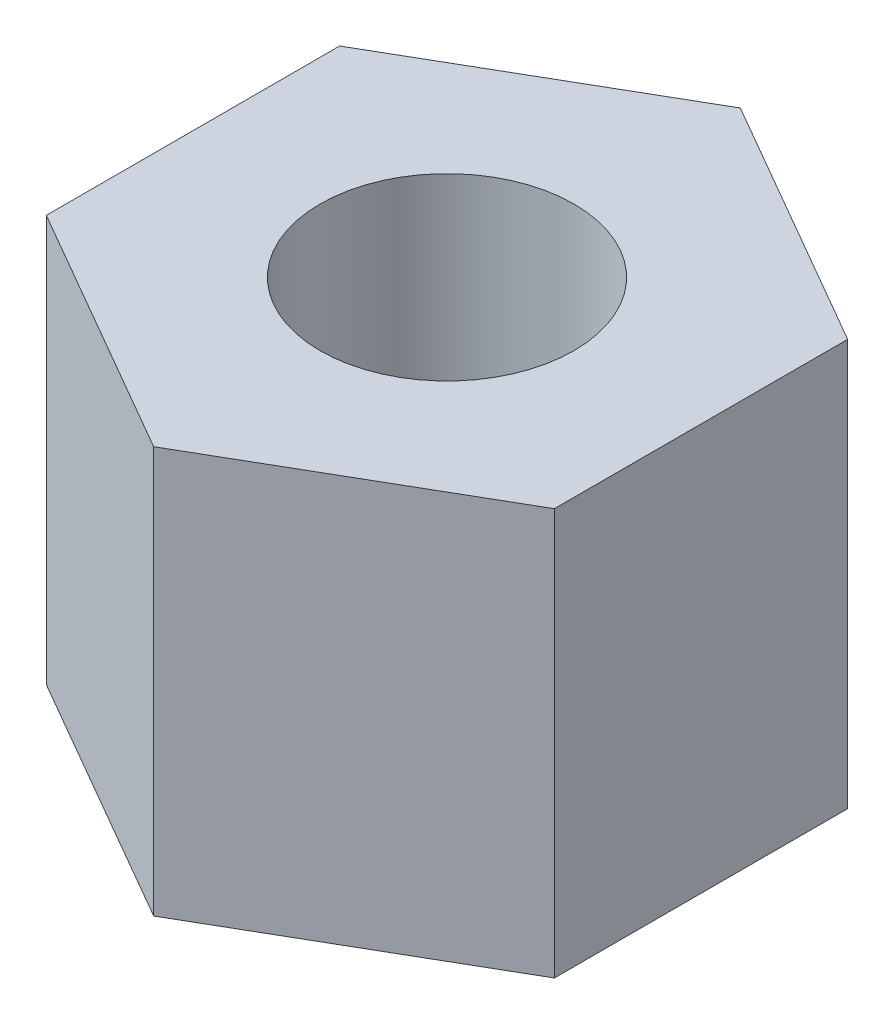
ISO-10303-21;
HEADER;
FILE_DESCRIPTION(('STEP AP214'),'2;1');
FILE_NAME('part.step','',(''),(''),'','','');
FILE_SCHEMA(('AUTOMOTIVE_DESIGN { 1 0 10303 214 1 1 1 1 }'));
ENDSEC;
DATA;
#1=APPLICATION_CONTEXT('core data for automotive mechanical design processes');
#2=APPLICATION_PROTOCOL_DEFINITION('international standard','automotive_design',2000,#1);
#3=PRODUCT_CONTEXT('',#1,'mechanical');
#4=PRODUCT('Part','Part','',(#3));
#5=PRODUCT_RELATED_PRODUCT_CATEGORY('part','',(#4));
#6=PRODUCT_DEFINITION_FORMATION('','',#4);
#7=PRODUCT_DEFINITION_CONTEXT('part definition',#1,'design');
#8=PRODUCT_DEFINITION('design','',#6,#7);
#9=PRODUCT_DEFINITION_SHAPE('','',#8);
#10=(LENGTH_UNIT() NAMED_UNIT(*) SI_UNIT(.MILLI.,.METRE.));
#11=(NAMED_UNIT(*) PLANE_ANGLE_UNIT() SI_UNIT($,.RADIAN.));
#12=(NAMED_UNIT(*) SI_UNIT($,.STERADIAN.) SOLID_ANGLE_UNIT());
#13=UNCERTAINTY_MEASURE_WITH_UNIT(LENGTH_MEASURE(1.E-05),#10,'distance_accuracy_value','');
#14=(GEOMETRIC_REPRESENTATION_CONTEXT(3) GLOBAL_UNCERTAINTY_ASSIGNED_CONTEXT((#13)) GLOBAL_UNIT_ASSIGNED_CONTEXT((#10,
#11,#12)) REPRESENTATION_CONTEXT('',''));
#15=CARTESIAN_POINT('',(0.,0.,0.));
#16=DIRECTION('',(0.,0.,1.));
#17=DIRECTION('',(1.,0.,0.));
#18=AXIS2_PLACEMENT_3D('',#15,#16,#17);
#19=CARTESIAN_POINT('',(1.25,4.,-2.1650635094611));
#20=DIRECTION('',(-0.5,0.,0.866025403784438));
#21=DIRECTION('',(0.866025403784438,0.,0.5));
#22=AXIS2_PLACEMENT_3D('',#19,#20,#21);
#23=PLANE('',#22);
#24=DIRECTION('',(-0.866025403784438,0.,-0.5));
#25=VECTOR('',#24,1.);
#26=CARTESIAN_POINT('',(1.25,0.,-2.1650635094611));
#27=LINE('',#26,#25);
#28=CARTESIAN_POINT('',(2.5,0.,-1.44337567297407));
#29=VERTEX_POINT('',#28);
#30=CARTESIAN_POINT('',(0.,0.,-2.88675134594813));
#31=VERTEX_POINT('',#30);
#32=EDGE_CURVE('E121',#29,#31,#27,.T.);
#33=ORIENTED_EDGE('',*,*,#32,.T.);
#34=DIRECTION('',(0.,-1.,0.));
#35=VECTOR('',#34,1.);
#36=CARTESIAN_POINT('',(0.,4.,-2.88675134594813));
#37=LINE('',#36,#35);
#38=CARTESIAN_POINT('',(0.,4.,-2.88675134594813));
#39=VERTEX_POINT('',#38);
#40=EDGE_CURVE('E11',#39,#31,#37,.T.);
#41=ORIENTED_EDGE('',*,*,#40,.F.);
#42=DIRECTION('',(-0.866025403784438,0.,-0.5));
#43=VECTOR('',#42,1.);
#44=CARTESIAN_POINT('',(1.25,4.,-2.1650635094611));
#45=LINE('',#44,#43);
#46=CARTESIAN_POINT('',(2.5,4.,-1.44337567297407));
#47=VERTEX_POINT('',#46);
#48=EDGE_CURVE('E131',#47,#39,#45,.T.);
#49=ORIENTED_EDGE('',*,*,#48,.F.);
#50=DIRECTION('',(0.,-1.,0.));
#51=VECTOR('',#50,1.);
#52=CARTESIAN_POINT('',(2.5,4.,-1.44337567297407));
#53=LINE('',#52,#51);
#54=EDGE_CURVE('E117',#47,#29,#53,.T.);
#55=ORIENTED_EDGE('',*,*,#54,.T.);
#56=EDGE_LOOP('',(#33,#41,#49,#55));
#57=FACE_BOUND('',#56,.T.);
#58=ADVANCED_FACE('F36',(#57),#23,.F.);
#59=CARTESIAN_POINT('',(-1.25,4.,-2.1650635094611));
#60=DIRECTION('',(0.500000000000001,0.,0.866025403784438));
#61=DIRECTION('',(0.866025403784438,0.,-0.500000000000001));
#62=AXIS2_PLACEMENT_3D('',#59,#60,#61);
#63=PLANE('',#62);
#64=DIRECTION('',(-0.866025403784438,0.,0.500000000000001));
#65=VECTOR('',#64,1.);
#66=CARTESIAN_POINT('',(-1.25,0.,-2.1650635094611));
#67=LINE('',#66,#65);
#68=CARTESIAN_POINT('',(-2.5,0.,-1.44337567297407));
#69=VERTEX_POINT('',#68);
#70=EDGE_CURVE('E124',#31,#69,#67,.T.);
#71=ORIENTED_EDGE('',*,*,#70,.T.);
#72=DIRECTION('',(0.,-1.,0.));
#73=VECTOR('',#72,1.);
#74=CARTESIAN_POINT('',(-2.5,4.,-1.44337567297407));
#75=LINE('',#74,#73);
#76=CARTESIAN_POINT('',(-2.5,4.,-1.44337567297407));
#77=VERTEX_POINT('',#76);
#78=EDGE_CURVE('E45',#77,#69,#75,.T.);
#79=ORIENTED_EDGE('',*,*,#78,.F.);
#80=DIRECTION('',(-0.866025403784438,0.,0.500000000000001));
#81=VECTOR('',#80,1.);
#82=CARTESIAN_POINT('',(-1.25,4.,-2.1650635094611));
#83=LINE('',#82,#81);
#84=EDGE_CURVE('E90',#39,#77,#83,.T.);
#85=ORIENTED_EDGE('',*,*,#84,.F.);
#86=ORIENTED_EDGE('',*,*,#40,.T.);
#87=EDGE_LOOP('',(#71,#79,#85,#86));
#88=FACE_BOUND('',#87,.T.);
#89=ADVANCED_FACE('F157',(#88),#63,.F.);
#90=CARTESIAN_POINT('',(-2.5,4.,0.));
#91=DIRECTION('',(1.,0.,0.));
#92=DIRECTION('',(0.,0.,-1.));
#93=AXIS2_PLACEMENT_3D('',#90,#91,#92);
#94=PLANE('',#93);
#95=DIRECTION('',(0.,0.,1.));
#96=VECTOR('',#95,1.);
#97=CARTESIAN_POINT('',(-2.5,0.,0.));
#98=LINE('',#97,#96);
#99=CARTESIAN_POINT('',(-2.5,0.,1.44337567297407));
#100=VERTEX_POINT('',#99);
#101=EDGE_CURVE('E126',#69,#100,#98,.T.);
#102=ORIENTED_EDGE('',*,*,#101,.T.);
#103=DIRECTION('',(0.,-1.,0.));
#104=VECTOR('',#103,1.);
#105=CARTESIAN_POINT('',(-2.5,4.,1.44337567297407));
#106=LINE('',#105,#104);
#107=CARTESIAN_POINT('',(-2.5,4.,1.44337567297407));
#108=VERTEX_POINT('',#107);
#109=EDGE_CURVE('E112',#108,#100,#106,.T.);
#110=ORIENTED_EDGE('',*,*,#109,.F.);
#111=DIRECTION('',(0.,0.,1.));
#112=VECTOR('',#111,1.);
#113=CARTESIAN_POINT('',(-2.5,4.,0.));
#114=LINE('',#113,#112);
#115=EDGE_CURVE('E103',#77,#108,#114,.T.);
#116=ORIENTED_EDGE('',*,*,#115,.F.);
#117=ORIENTED_EDGE('',*,*,#78,.T.);
#118=EDGE_LOOP('',(#102,#110,#116,#117));
#119=FACE_BOUND('',#118,.T.);
#120=ADVANCED_FACE('F138',(#119),#94,.F.);
#121=CARTESIAN_POINT('',(-1.25,4.,2.1650635094611));
#122=DIRECTION('',(0.499999999999999,0.,-0.866025403784439));
#123=DIRECTION('',(-0.866025403784439,0.,-0.499999999999999));
#124=AXIS2_PLACEMENT_3D('',#121,#122,#123);
#125=PLANE('',#124);
#126=DIRECTION('',(0.866025403784439,0.,0.499999999999999));
#127=VECTOR('',#126,1.);
#128=CARTESIAN_POINT('',(-1.25,0.,2.1650635094611));
#129=LINE('',#128,#127);
#130=CARTESIAN_POINT('',(0.,0.,2.88675134594813));
#131=VERTEX_POINT('',#130);
#132=EDGE_CURVE('E111',#100,#131,#129,.T.);
#133=ORIENTED_EDGE('',*,*,#132,.T.);
#134=DIRECTION('',(0.,-1.,0.));
#135=VECTOR('',#134,1.);
#136=CARTESIAN_POINT('',(0.,4.,2.88675134594813));
#137=LINE('',#136,#135);
#138=CARTESIAN_POINT('',(0.,4.,2.88675134594813));
#139=VERTEX_POINT('',#138);
#140=EDGE_CURVE('E108',#139,#131,#137,.T.);
#141=ORIENTED_EDGE('',*,*,#140,.F.);
#142=DIRECTION('',(0.866025403784439,0.,0.499999999999999));
#143=VECTOR('',#142,1.);
#144=CARTESIAN_POINT('',(-1.25,4.,2.1650635094611));
#145=LINE('',#144,#143);
#146=EDGE_CURVE('E97',#108,#139,#145,.T.);
#147=ORIENTED_EDGE('',*,*,#146,.F.);
#148=ORIENTED_EDGE('',*,*,#109,.T.);
#149=EDGE_LOOP('',(#133,#141,#147,#148));
#150=FACE_BOUND('',#149,.T.);
#151=ADVANCED_FACE('F109',(#150),#125,.F.);
#152=CARTESIAN_POINT('',(1.25,4.,2.1650635094611));
#153=DIRECTION('',(-0.5,0.,-0.866025403784439));
#154=DIRECTION('',(-0.866025403784439,0.,0.5));
#155=AXIS2_PLACEMENT_3D('',#152,#153,#154);
#156=PLANE('',#155);
#157=DIRECTION('',(0.866025403784439,0.,-0.5));
#158=VECTOR('',#157,1.);
#159=CARTESIAN_POINT('',(1.25,0.,2.1650635094611));
#160=LINE('',#159,#158);
#161=CARTESIAN_POINT('',(2.5,0.,1.44337567297406));
#162=VERTEX_POINT('',#161);
#163=EDGE_CURVE('E76',#131,#162,#160,.T.);
#164=ORIENTED_EDGE('',*,*,#163,.T.);
#165=DIRECTION('',(0.,-1.,0.));
#166=VECTOR('',#165,1.);
#167=CARTESIAN_POINT('',(2.5,4.,1.44337567297406));
#168=LINE('',#167,#166);
#169=CARTESIAN_POINT('',(2.5,4.,1.44337567297406));
#170=VERTEX_POINT('',#169);
#171=EDGE_CURVE('E113',#170,#162,#168,.T.);
#172=ORIENTED_EDGE('',*,*,#171,.F.);
#173=DIRECTION('',(0.866025403784439,0.,-0.5));
#174=VECTOR('',#173,1.);
#175=CARTESIAN_POINT('',(1.25,4.,2.1650635094611));
#176=LINE('',#175,#174);
#177=EDGE_CURVE('E101',#139,#170,#176,.T.);
#178=ORIENTED_EDGE('',*,*,#177,.F.);
#179=ORIENTED_EDGE('',*,*,#140,.T.);
#180=EDGE_LOOP('',(#164,#172,#178,#179));
#181=FACE_BOUND('',#180,.T.);
#182=ADVANCED_FACE('F115',(#181),#156,.F.);
#183=CARTESIAN_POINT('',(2.5,4.,0.));
#184=DIRECTION('',(-1.,0.,0.));
#185=DIRECTION('',(0.,0.,1.));
#186=AXIS2_PLACEMENT_3D('',#183,#184,#185);
#187=PLANE('',#186);
#188=DIRECTION('',(0.,0.,-1.));
#189=VECTOR('',#188,1.);
#190=CARTESIAN_POINT('',(2.5,0.,0.));
#191=LINE('',#190,#189);
#192=EDGE_CURVE('E82',#162,#29,#191,.T.);
#193=ORIENTED_EDGE('',*,*,#192,.T.);
#194=ORIENTED_EDGE('',*,*,#54,.F.);
#195=DIRECTION('',(0.,0.,-1.));
#196=VECTOR('',#195,1.);
#197=CARTESIAN_POINT('',(2.5,4.,0.));
#198=LINE('',#197,#196);
#199=EDGE_CURVE('E53',#170,#47,#198,.T.);
#200=ORIENTED_EDGE('',*,*,#199,.F.);
#201=ORIENTED_EDGE('',*,*,#171,.T.);
#202=EDGE_LOOP('',(#193,#194,#200,#201));
#203=FACE_BOUND('',#202,.T.);
#204=ADVANCED_FACE('F145',(#203),#187,.F.);
#205=CARTESIAN_POINT('',(0.,4.,0.));
#206=DIRECTION('',(0.,1.,0.));
#207=DIRECTION('',(0.,0.,1.));
#208=AXIS2_PLACEMENT_3D('',#205,#206,#207);
#209=PLANE('',#208);
#210=CARTESIAN_POINT('',(0.,4.,0.));
#211=DIRECTION('',(0.,1.,0.));
#212=DIRECTION('',(0.,0.,1.));
#213=AXIS2_PLACEMENT_3D('',#210,#211,#212);
#214=CIRCLE('',#213,1.25);
#215=CARTESIAN_POINT('',(0.,4.,1.25));
#216=VERTEX_POINT('',#215);
#217=EDGE_CURVE('E39',#216,#216,#214,.T.);
#218=ORIENTED_EDGE('',*,*,#217,.F.);
#219=EDGE_LOOP('',(#218));
#220=FACE_BOUND('',#219,.T.);
#221=ORIENTED_EDGE('',*,*,#48,.T.);
#222=ORIENTED_EDGE('',*,*,#84,.T.);
#223=ORIENTED_EDGE('',*,*,#115,.T.);
#224=ORIENTED_EDGE('',*,*,#146,.T.);
#225=ORIENTED_EDGE('',*,*,#177,.T.);
#226=ORIENTED_EDGE('',*,*,#199,.T.);
#227=EDGE_LOOP('',(#221,#222,#223,#224,#225,#226));
#228=FACE_BOUND('',#227,.T.);
#229=ADVANCED_FACE('F99',(#220,#228),#209,.T.);
#230=CARTESIAN_POINT('',(0.,0.,0.));
#231=DIRECTION('',(0.,1.,0.));
#232=DIRECTION('',(0.,0.,1.));
#233=AXIS2_PLACEMENT_3D('',#230,#231,#232);
#234=PLANE('',#233);
#235=CARTESIAN_POINT('',(0.,0.,0.));
#236=DIRECTION('',(0.,-1.,0.));
#237=DIRECTION('',(0.,0.,-1.));
#238=AXIS2_PLACEMENT_3D('',#235,#236,#237);
#239=CIRCLE('',#238,1.25);
#240=CARTESIAN_POINT('',(0.,0.,-1.25));
#241=VERTEX_POINT('',#240);
#242=EDGE_CURVE('E218',#241,#241,#239,.T.);
#243=ORIENTED_EDGE('',*,*,#242,.F.);
#244=EDGE_LOOP('',(#243));
#245=FACE_BOUND('',#244,.T.);
#246=ORIENTED_EDGE('',*,*,#32,.F.);
#247=ORIENTED_EDGE('',*,*,#192,.F.);
#248=ORIENTED_EDGE('',*,*,#163,.F.);
#249=ORIENTED_EDGE('',*,*,#132,.F.);
#250=ORIENTED_EDGE('',*,*,#101,.F.);
#251=ORIENTED_EDGE('',*,*,#70,.F.);
#252=EDGE_LOOP('',(#246,#247,#248,#249,#250,#251));
#253=FACE_BOUND('',#252,.T.);
#254=ADVANCED_FACE('F141',(#245,#253),#234,.F.);
#255=CARTESIAN_POINT('',(0.,0.,0.));
#256=DIRECTION('',(0.,-1.,0.));
#257=DIRECTION('',(0.,0.,-1.));
#258=AXIS2_PLACEMENT_3D('',#255,#256,#257);
#259=CYLINDRICAL_SURFACE('',#258,1.25);
#260=ORIENTED_EDGE('',*,*,#217,.T.);
#261=EDGE_LOOP('',(#260));
#262=FACE_BOUND('',#261,.T.);
#263=ORIENTED_EDGE('',*,*,#242,.T.);
#264=EDGE_LOOP('',(#263));
#265=FACE_BOUND('',#264,.T.);
#266=ADVANCED_FACE('F197',(#262,#265),#259,.F.);
#267=CLOSED_SHELL('',(#58,#89,#120,#151,#182,#204,#229,#254,#266));
#268=MANIFOLD_SOLID_BREP('B2',#267);
#269=ADVANCED_BREP_SHAPE_REPRESENTATION('',(#18,#268),#14);
#270=SHAPE_DEFINITION_REPRESENTATION(#9,#269);
ENDSEC;
END-ISO-10303-21;
